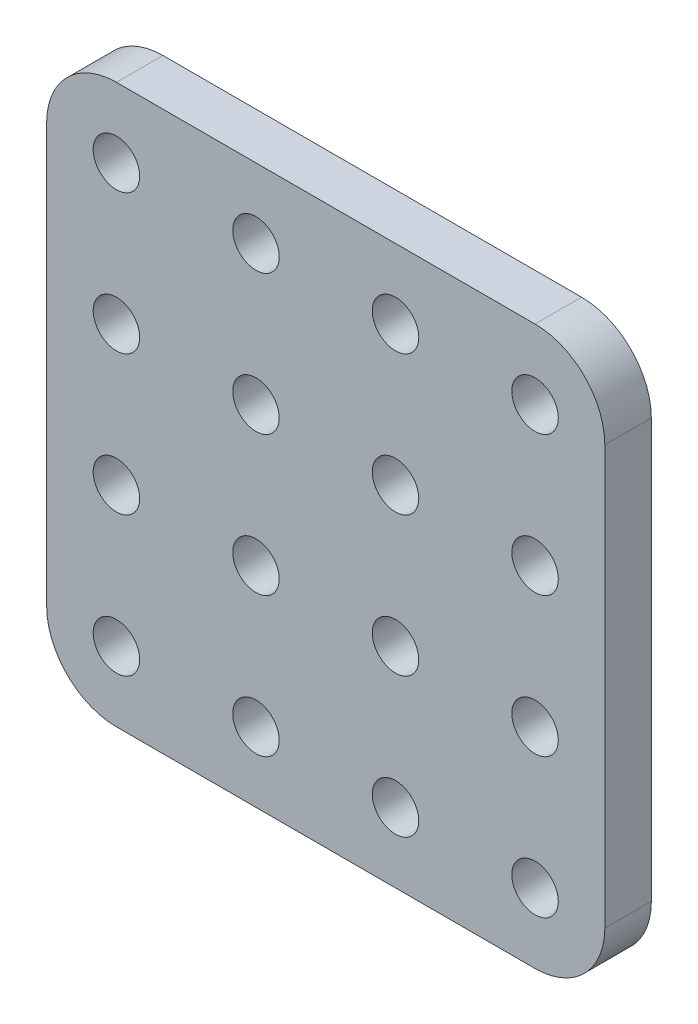
ISO-10303-21;
HEADER;
FILE_DESCRIPTION(('STEP AP214'),'2;1');
FILE_NAME('part.step','',(''),(''),'','','');
FILE_SCHEMA(('AUTOMOTIVE_DESIGN { 1 0 10303 214 1 1 1 1 }'));
ENDSEC;
DATA;
#1=APPLICATION_CONTEXT('core data for automotive mechanical design processes');
#2=APPLICATION_PROTOCOL_DEFINITION('international standard','automotive_design',2000,#1);
#3=PRODUCT_CONTEXT('',#1,'mechanical');
#4=PRODUCT('Part','Part','',(#3));
#5=PRODUCT_RELATED_PRODUCT_CATEGORY('part','',(#4));
#6=PRODUCT_DEFINITION_FORMATION('','',#4);
#7=PRODUCT_DEFINITION_CONTEXT('part definition',#1,'design');
#8=PRODUCT_DEFINITION('design','',#6,#7);
#9=PRODUCT_DEFINITION_SHAPE('','',#8);
#10=(LENGTH_UNIT() NAMED_UNIT(*) SI_UNIT(.MILLI.,.METRE.));
#11=(NAMED_UNIT(*) PLANE_ANGLE_UNIT() SI_UNIT($,.RADIAN.));
#12=(NAMED_UNIT(*) SI_UNIT($,.STERADIAN.) SOLID_ANGLE_UNIT());
#13=UNCERTAINTY_MEASURE_WITH_UNIT(LENGTH_MEASURE(1.E-05),#10,'distance_accuracy_value','');
#14=(GEOMETRIC_REPRESENTATION_CONTEXT(3) GLOBAL_UNCERTAINTY_ASSIGNED_CONTEXT((#13)) GLOBAL_UNIT_ASSIGNED_CONTEXT((#10,
#11,#12)) REPRESENTATION_CONTEXT('',''));
#15=CARTESIAN_POINT('',(0.,0.,0.));
#16=DIRECTION('',(0.,0.,1.));
#17=DIRECTION('',(1.,0.,0.));
#18=AXIS2_PLACEMENT_3D('',#15,#16,#17);
#19=CARTESIAN_POINT('',(-101.443383637,101.056539338,3.));
#20=DIRECTION('',(0.,0.,1.));
#21=DIRECTION('',(1.,0.,0.));
#22=AXIS2_PLACEMENT_3D('',#19,#20,#21);
#23=PLANE('',#22);
#24=CARTESIAN_POINT('',(-83.443383637,74.056539338,3.));
#25=DIRECTION('',(0.,0.,1.));
#26=DIRECTION('',(1.,0.,0.));
#27=AXIS2_PLACEMENT_3D('',#24,#25,#26);
#28=CIRCLE('',#27,1.5);
#29=CARTESIAN_POINT('',(-81.943383637,74.056539338,3.));
#30=VERTEX_POINT('',#29);
#31=EDGE_CURVE('E260',#30,#30,#28,.T.);
#32=ORIENTED_EDGE('',*,*,#31,.F.);
#33=EDGE_LOOP('',(#32));
#34=FACE_BOUND('',#33,.T.);
#35=CARTESIAN_POINT('',(-101.443383637,74.056539338,3.));
#36=DIRECTION('',(0.,0.,1.));
#37=DIRECTION('',(1.,0.,0.));
#38=AXIS2_PLACEMENT_3D('',#35,#36,#37);
#39=CIRCLE('',#38,1.5);
#40=CARTESIAN_POINT('',(-99.943383637,74.056539338,3.));
#41=VERTEX_POINT('',#40);
#42=EDGE_CURVE('E248',#41,#41,#39,.T.);
#43=ORIENTED_EDGE('',*,*,#42,.F.);
#44=EDGE_LOOP('',(#43));
#45=FACE_BOUND('',#44,.T.);
#46=CARTESIAN_POINT('',(-83.443383637,83.056539338,3.));
#47=DIRECTION('',(0.,0.,1.));
#48=DIRECTION('',(1.,0.,0.));
#49=AXIS2_PLACEMENT_3D('',#46,#47,#48);
#50=CIRCLE('',#49,1.5);
#51=CARTESIAN_POINT('',(-81.943383637,83.056539338,3.));
#52=VERTEX_POINT('',#51);
#53=EDGE_CURVE('E236',#52,#52,#50,.T.);
#54=ORIENTED_EDGE('',*,*,#53,.F.);
#55=EDGE_LOOP('',(#54));
#56=FACE_BOUND('',#55,.T.);
#57=CARTESIAN_POINT('',(-101.443383637,83.056539338,3.));
#58=DIRECTION('',(0.,0.,1.));
#59=DIRECTION('',(1.,0.,0.));
#60=AXIS2_PLACEMENT_3D('',#57,#58,#59);
#61=CIRCLE('',#60,1.5);
#62=CARTESIAN_POINT('',(-99.943383637,83.056539338,3.));
#63=VERTEX_POINT('',#62);
#64=EDGE_CURVE('E224',#63,#63,#61,.T.);
#65=ORIENTED_EDGE('',*,*,#64,.F.);
#66=EDGE_LOOP('',(#65));
#67=FACE_BOUND('',#66,.T.);
#68=CARTESIAN_POINT('',(-83.443383637,92.056539338,3.));
#69=DIRECTION('',(0.,0.,1.));
#70=DIRECTION('',(1.,0.,0.));
#71=AXIS2_PLACEMENT_3D('',#68,#69,#70);
#72=CIRCLE('',#71,1.5);
#73=CARTESIAN_POINT('',(-81.943383637,92.056539338,3.));
#74=VERTEX_POINT('',#73);
#75=EDGE_CURVE('E212',#74,#74,#72,.T.);
#76=ORIENTED_EDGE('',*,*,#75,.F.);
#77=EDGE_LOOP('',(#76));
#78=FACE_BOUND('',#77,.T.);
#79=CARTESIAN_POINT('',(-101.443383637,92.056539338,3.));
#80=DIRECTION('',(0.,0.,1.));
#81=DIRECTION('',(1.,0.,0.));
#82=AXIS2_PLACEMENT_3D('',#79,#80,#81);
#83=CIRCLE('',#82,1.5);
#84=CARTESIAN_POINT('',(-99.943383637,92.056539338,3.));
#85=VERTEX_POINT('',#84);
#86=EDGE_CURVE('E200',#85,#85,#83,.T.);
#87=ORIENTED_EDGE('',*,*,#86,.F.);
#88=EDGE_LOOP('',(#87));
#89=FACE_BOUND('',#88,.T.);
#90=CARTESIAN_POINT('',(-83.443383637,101.056539338,3.));
#91=DIRECTION('',(0.,0.,1.));
#92=DIRECTION('',(1.,0.,0.));
#93=AXIS2_PLACEMENT_3D('',#90,#91,#92);
#94=CIRCLE('',#93,1.5);
#95=CARTESIAN_POINT('',(-81.943383637,101.056539338,3.));
#96=VERTEX_POINT('',#95);
#97=EDGE_CURVE('E188',#96,#96,#94,.T.);
#98=ORIENTED_EDGE('',*,*,#97,.F.);
#99=EDGE_LOOP('',(#98));
#100=FACE_BOUND('',#99,.T.);
#101=CARTESIAN_POINT('',(-101.443383637,101.056539338,3.));
#102=DIRECTION('',(0.,0.,1.));
#103=DIRECTION('',(1.,0.,0.));
#104=AXIS2_PLACEMENT_3D('',#101,#102,#103);
#105=CIRCLE('',#104,1.5);
#106=CARTESIAN_POINT('',(-99.943383637,101.056539338,3.));
#107=VERTEX_POINT('',#106);
#108=EDGE_CURVE('E134',#107,#107,#105,.T.);
#109=ORIENTED_EDGE('',*,*,#108,.F.);
#110=EDGE_LOOP('',(#109));
#111=FACE_BOUND('',#110,.T.);
#112=CARTESIAN_POINT('',(-101.443383637,101.056539338,3.));
#113=DIRECTION('',(0.,0.,1.));
#114=DIRECTION('',(1.,0.,0.));
#115=AXIS2_PLACEMENT_3D('',#112,#113,#114);
#116=CIRCLE('',#115,4.5);
#117=CARTESIAN_POINT('',(-101.443383637,105.556539338,3.));
#118=VERTEX_POINT('',#117);
#119=CARTESIAN_POINT('',(-105.943383637,101.056539338,3.));
#120=VERTEX_POINT('',#119);
#121=EDGE_CURVE('E145',#118,#120,#116,.T.);
#122=ORIENTED_EDGE('',*,*,#121,.T.);
#123=DIRECTION('',(0.,-1.,0.));
#124=VECTOR('',#123,1.);
#125=CARTESIAN_POINT('',(-105.943383637,101.056539338,3.));
#126=LINE('',#125,#124);
#127=CARTESIAN_POINT('',(-105.943383637,74.056539338,3.));
#128=VERTEX_POINT('',#127);
#129=EDGE_CURVE('E93',#120,#128,#126,.T.);
#130=ORIENTED_EDGE('',*,*,#129,.T.);
#131=CARTESIAN_POINT('',(-101.443383637,74.056539338,3.));
#132=DIRECTION('',(0.,0.,1.));
#133=DIRECTION('',(1.,0.,0.));
#134=AXIS2_PLACEMENT_3D('',#131,#132,#133);
#135=CIRCLE('',#134,4.5);
#136=CARTESIAN_POINT('',(-101.443383637,69.556539338,3.));
#137=VERTEX_POINT('',#136);
#138=EDGE_CURVE('E160',#128,#137,#135,.T.);
#139=ORIENTED_EDGE('',*,*,#138,.T.);
#140=DIRECTION('',(1.,0.,0.));
#141=VECTOR('',#140,1.);
#142=CARTESIAN_POINT('',(-101.443383637,69.556539338,3.));
#143=LINE('',#142,#141);
#144=CARTESIAN_POINT('',(-74.443383637,69.556539338,3.));
#145=VERTEX_POINT('',#144);
#146=EDGE_CURVE('E173',#137,#145,#143,.T.);
#147=ORIENTED_EDGE('',*,*,#146,.T.);
#148=CARTESIAN_POINT('',(-74.443383637,74.056539338,3.));
#149=DIRECTION('',(0.,0.,1.));
#150=DIRECTION('',(1.,0.,0.));
#151=AXIS2_PLACEMENT_3D('',#148,#149,#150);
#152=CIRCLE('',#151,4.5);
#153=CARTESIAN_POINT('',(-69.943383637,74.056539338,3.));
#154=VERTEX_POINT('',#153);
#155=EDGE_CURVE('E112',#145,#154,#152,.T.);
#156=ORIENTED_EDGE('',*,*,#155,.T.);
#157=DIRECTION('',(0.,1.,0.));
#158=VECTOR('',#157,1.);
#159=CARTESIAN_POINT('',(-69.943383637,74.056539338,3.));
#160=LINE('',#159,#158);
#161=CARTESIAN_POINT('',(-69.943383637,101.056539338,3.));
#162=VERTEX_POINT('',#161);
#163=EDGE_CURVE('E106',#154,#162,#160,.T.);
#164=ORIENTED_EDGE('',*,*,#163,.T.);
#165=CARTESIAN_POINT('',(-74.443383637,101.056539338,3.));
#166=DIRECTION('',(0.,0.,1.));
#167=DIRECTION('',(1.,0.,0.));
#168=AXIS2_PLACEMENT_3D('',#165,#166,#167);
#169=CIRCLE('',#168,4.5);
#170=CARTESIAN_POINT('',(-74.443383637,105.556539338,3.));
#171=VERTEX_POINT('',#170);
#172=EDGE_CURVE('E110',#162,#171,#169,.T.);
#173=ORIENTED_EDGE('',*,*,#172,.T.);
#174=DIRECTION('',(-1.,0.,0.));
#175=VECTOR('',#174,1.);
#176=CARTESIAN_POINT('',(-74.443383637,105.556539338,3.));
#177=LINE('',#176,#175);
#178=EDGE_CURVE('E50',#171,#118,#177,.T.);
#179=ORIENTED_EDGE('',*,*,#178,.T.);
#180=EDGE_LOOP('',(#122,#130,#139,#147,#156,#164,#173,#179));
#181=FACE_BOUND('',#180,.T.);
#182=CARTESIAN_POINT('',(-92.443383637,101.056539338,3.));
#183=DIRECTION('',(0.,0.,1.));
#184=DIRECTION('',(1.,0.,0.));
#185=AXIS2_PLACEMENT_3D('',#182,#183,#184);
#186=CIRCLE('',#185,1.5);
#187=CARTESIAN_POINT('',(-90.943383637,101.056539338,3.));
#188=VERTEX_POINT('',#187);
#189=EDGE_CURVE('E182',#188,#188,#186,.T.);
#190=ORIENTED_EDGE('',*,*,#189,.F.);
#191=EDGE_LOOP('',(#190));
#192=FACE_BOUND('',#191,.T.);
#193=CARTESIAN_POINT('',(-74.443383637,101.056539338,3.));
#194=DIRECTION('',(0.,0.,1.));
#195=DIRECTION('',(1.,0.,0.));
#196=AXIS2_PLACEMENT_3D('',#193,#194,#195);
#197=CIRCLE('',#196,1.5);
#198=CARTESIAN_POINT('',(-72.943383637,101.056539338,3.));
#199=VERTEX_POINT('',#198);
#200=EDGE_CURVE('E194',#199,#199,#197,.T.);
#201=ORIENTED_EDGE('',*,*,#200,.F.);
#202=EDGE_LOOP('',(#201));
#203=FACE_BOUND('',#202,.T.);
#204=CARTESIAN_POINT('',(-92.443383637,92.056539338,3.));
#205=DIRECTION('',(0.,0.,1.));
#206=DIRECTION('',(1.,0.,0.));
#207=AXIS2_PLACEMENT_3D('',#204,#205,#206);
#208=CIRCLE('',#207,1.5);
#209=CARTESIAN_POINT('',(-90.943383637,92.056539338,3.));
#210=VERTEX_POINT('',#209);
#211=EDGE_CURVE('E206',#210,#210,#208,.T.);
#212=ORIENTED_EDGE('',*,*,#211,.F.);
#213=EDGE_LOOP('',(#212));
#214=FACE_BOUND('',#213,.T.);
#215=CARTESIAN_POINT('',(-74.443383637,92.056539338,3.));
#216=DIRECTION('',(0.,0.,1.));
#217=DIRECTION('',(1.,0.,0.));
#218=AXIS2_PLACEMENT_3D('',#215,#216,#217);
#219=CIRCLE('',#218,1.5);
#220=CARTESIAN_POINT('',(-72.943383637,92.056539338,3.));
#221=VERTEX_POINT('',#220);
#222=EDGE_CURVE('E218',#221,#221,#219,.T.);
#223=ORIENTED_EDGE('',*,*,#222,.F.);
#224=EDGE_LOOP('',(#223));
#225=FACE_BOUND('',#224,.T.);
#226=CARTESIAN_POINT('',(-92.443383637,83.056539338,3.));
#227=DIRECTION('',(0.,0.,1.));
#228=DIRECTION('',(1.,0.,0.));
#229=AXIS2_PLACEMENT_3D('',#226,#227,#228);
#230=CIRCLE('',#229,1.5);
#231=CARTESIAN_POINT('',(-90.943383637,83.056539338,3.));
#232=VERTEX_POINT('',#231);
#233=EDGE_CURVE('E230',#232,#232,#230,.T.);
#234=ORIENTED_EDGE('',*,*,#233,.F.);
#235=EDGE_LOOP('',(#234));
#236=FACE_BOUND('',#235,.T.);
#237=CARTESIAN_POINT('',(-74.443383637,83.056539338,3.));
#238=DIRECTION('',(0.,0.,1.));
#239=DIRECTION('',(1.,0.,0.));
#240=AXIS2_PLACEMENT_3D('',#237,#238,#239);
#241=CIRCLE('',#240,1.5);
#242=CARTESIAN_POINT('',(-72.943383637,83.056539338,3.));
#243=VERTEX_POINT('',#242);
#244=EDGE_CURVE('E242',#243,#243,#241,.T.);
#245=ORIENTED_EDGE('',*,*,#244,.F.);
#246=EDGE_LOOP('',(#245));
#247=FACE_BOUND('',#246,.T.);
#248=CARTESIAN_POINT('',(-92.443383637,74.056539338,3.));
#249=DIRECTION('',(0.,0.,1.));
#250=DIRECTION('',(1.,0.,0.));
#251=AXIS2_PLACEMENT_3D('',#248,#249,#250);
#252=CIRCLE('',#251,1.5);
#253=CARTESIAN_POINT('',(-90.943383637,74.056539338,3.));
#254=VERTEX_POINT('',#253);
#255=EDGE_CURVE('E254',#254,#254,#252,.T.);
#256=ORIENTED_EDGE('',*,*,#255,.F.);
#257=EDGE_LOOP('',(#256));
#258=FACE_BOUND('',#257,.T.);
#259=CARTESIAN_POINT('',(-74.443383637,74.056539338,3.));
#260=DIRECTION('',(0.,0.,1.));
#261=DIRECTION('',(1.,0.,0.));
#262=AXIS2_PLACEMENT_3D('',#259,#260,#261);
#263=CIRCLE('',#262,1.5);
#264=CARTESIAN_POINT('',(-72.943383637,74.056539338,3.));
#265=VERTEX_POINT('',#264);
#266=EDGE_CURVE('E266',#265,#265,#263,.T.);
#267=ORIENTED_EDGE('',*,*,#266,.F.);
#268=EDGE_LOOP('',(#267));
#269=FACE_BOUND('',#268,.T.);
#270=ADVANCED_FACE('F33',(#34,#45,#56,#67,#78,#89,#100,#111,#181,#192,#203,#214,#225,#236,#247,
#258,#269),#23,.T.);
#271=CARTESIAN_POINT('',(-101.443383637,101.056539338,0.));
#272=DIRECTION('',(0.,0.,1.));
#273=DIRECTION('',(1.,0.,0.));
#274=AXIS2_PLACEMENT_3D('',#271,#272,#273);
#275=PLANE('',#274);
#276=CARTESIAN_POINT('',(-83.443383637,74.056539338,0.));
#277=DIRECTION('',(0.,0.,1.));
#278=DIRECTION('',(1.,0.,0.));
#279=AXIS2_PLACEMENT_3D('',#276,#277,#278);
#280=CIRCLE('',#279,1.5);
#281=CARTESIAN_POINT('',(-81.943383637,74.056539338,0.));
#282=VERTEX_POINT('',#281);
#283=EDGE_CURVE('E263',#282,#282,#280,.T.);
#284=ORIENTED_EDGE('',*,*,#283,.T.);
#285=EDGE_LOOP('',(#284));
#286=FACE_BOUND('',#285,.T.);
#287=CARTESIAN_POINT('',(-101.443383637,74.056539338,0.));
#288=DIRECTION('',(0.,0.,1.));
#289=DIRECTION('',(1.,0.,0.));
#290=AXIS2_PLACEMENT_3D('',#287,#288,#289);
#291=CIRCLE('',#290,1.5);
#292=CARTESIAN_POINT('',(-99.943383637,74.056539338,0.));
#293=VERTEX_POINT('',#292);
#294=EDGE_CURVE('E251',#293,#293,#291,.T.);
#295=ORIENTED_EDGE('',*,*,#294,.T.);
#296=EDGE_LOOP('',(#295));
#297=FACE_BOUND('',#296,.T.);
#298=CARTESIAN_POINT('',(-83.443383637,83.056539338,0.));
#299=DIRECTION('',(0.,0.,1.));
#300=DIRECTION('',(1.,0.,0.));
#301=AXIS2_PLACEMENT_3D('',#298,#299,#300);
#302=CIRCLE('',#301,1.5);
#303=CARTESIAN_POINT('',(-81.943383637,83.056539338,0.));
#304=VERTEX_POINT('',#303);
#305=EDGE_CURVE('E239',#304,#304,#302,.T.);
#306=ORIENTED_EDGE('',*,*,#305,.T.);
#307=EDGE_LOOP('',(#306));
#308=FACE_BOUND('',#307,.T.);
#309=CARTESIAN_POINT('',(-101.443383637,83.056539338,0.));
#310=DIRECTION('',(0.,0.,1.));
#311=DIRECTION('',(1.,0.,0.));
#312=AXIS2_PLACEMENT_3D('',#309,#310,#311);
#313=CIRCLE('',#312,1.5);
#314=CARTESIAN_POINT('',(-99.943383637,83.056539338,0.));
#315=VERTEX_POINT('',#314);
#316=EDGE_CURVE('E227',#315,#315,#313,.T.);
#317=ORIENTED_EDGE('',*,*,#316,.T.);
#318=EDGE_LOOP('',(#317));
#319=FACE_BOUND('',#318,.T.);
#320=CARTESIAN_POINT('',(-83.443383637,92.056539338,0.));
#321=DIRECTION('',(0.,0.,1.));
#322=DIRECTION('',(1.,0.,0.));
#323=AXIS2_PLACEMENT_3D('',#320,#321,#322);
#324=CIRCLE('',#323,1.5);
#325=CARTESIAN_POINT('',(-81.943383637,92.056539338,0.));
#326=VERTEX_POINT('',#325);
#327=EDGE_CURVE('E215',#326,#326,#324,.T.);
#328=ORIENTED_EDGE('',*,*,#327,.T.);
#329=EDGE_LOOP('',(#328));
#330=FACE_BOUND('',#329,.T.);
#331=CARTESIAN_POINT('',(-101.443383637,92.056539338,0.));
#332=DIRECTION('',(0.,0.,1.));
#333=DIRECTION('',(1.,0.,0.));
#334=AXIS2_PLACEMENT_3D('',#331,#332,#333);
#335=CIRCLE('',#334,1.5);
#336=CARTESIAN_POINT('',(-99.943383637,92.056539338,0.));
#337=VERTEX_POINT('',#336);
#338=EDGE_CURVE('E203',#337,#337,#335,.T.);
#339=ORIENTED_EDGE('',*,*,#338,.T.);
#340=EDGE_LOOP('',(#339));
#341=FACE_BOUND('',#340,.T.);
#342=CARTESIAN_POINT('',(-83.443383637,101.056539338,0.));
#343=DIRECTION('',(0.,0.,1.));
#344=DIRECTION('',(1.,0.,0.));
#345=AXIS2_PLACEMENT_3D('',#342,#343,#344);
#346=CIRCLE('',#345,1.5);
#347=CARTESIAN_POINT('',(-81.943383637,101.056539338,0.));
#348=VERTEX_POINT('',#347);
#349=EDGE_CURVE('E191',#348,#348,#346,.T.);
#350=ORIENTED_EDGE('',*,*,#349,.T.);
#351=EDGE_LOOP('',(#350));
#352=FACE_BOUND('',#351,.T.);
#353=CARTESIAN_POINT('',(-101.443383637,101.056539338,0.));
#354=DIRECTION('',(0.,0.,1.));
#355=DIRECTION('',(1.,0.,0.));
#356=AXIS2_PLACEMENT_3D('',#353,#354,#355);
#357=CIRCLE('',#356,1.5);
#358=CARTESIAN_POINT('',(-99.943383637,101.056539338,0.));
#359=VERTEX_POINT('',#358);
#360=EDGE_CURVE('E179',#359,#359,#357,.T.);
#361=ORIENTED_EDGE('',*,*,#360,.T.);
#362=EDGE_LOOP('',(#361));
#363=FACE_BOUND('',#362,.T.);
#364=CARTESIAN_POINT('',(-101.443383637,101.056539338,0.));
#365=DIRECTION('',(0.,0.,1.));
#366=DIRECTION('',(1.,0.,0.));
#367=AXIS2_PLACEMENT_3D('',#364,#365,#366);
#368=CIRCLE('',#367,4.5);
#369=CARTESIAN_POINT('',(-101.443383637,105.556539338,0.));
#370=VERTEX_POINT('',#369);
#371=CARTESIAN_POINT('',(-105.943383637,101.056539338,0.));
#372=VERTEX_POINT('',#371);
#373=EDGE_CURVE('E130',#370,#372,#368,.T.);
#374=ORIENTED_EDGE('',*,*,#373,.F.);
#375=DIRECTION('',(-1.,0.,0.));
#376=VECTOR('',#375,1.);
#377=CARTESIAN_POINT('',(-74.443383637,105.556539338,0.));
#378=LINE('',#377,#376);
#379=CARTESIAN_POINT('',(-74.443383637,105.556539338,0.));
#380=VERTEX_POINT('',#379);
#381=EDGE_CURVE('E85',#380,#370,#378,.T.);
#382=ORIENTED_EDGE('',*,*,#381,.F.);
#383=CARTESIAN_POINT('',(-74.443383637,101.056539338,0.));
#384=DIRECTION('',(0.,0.,1.));
#385=DIRECTION('',(1.,0.,0.));
#386=AXIS2_PLACEMENT_3D('',#383,#384,#385);
#387=CIRCLE('',#386,4.5);
#388=CARTESIAN_POINT('',(-69.943383637,101.056539338,0.));
#389=VERTEX_POINT('',#388);
#390=EDGE_CURVE('E79',#389,#380,#387,.T.);
#391=ORIENTED_EDGE('',*,*,#390,.F.);
#392=DIRECTION('',(0.,1.,0.));
#393=VECTOR('',#392,1.);
#394=CARTESIAN_POINT('',(-69.943383637,74.056539338,0.));
#395=LINE('',#394,#393);
#396=CARTESIAN_POINT('',(-69.943383637,74.056539338,0.));
#397=VERTEX_POINT('',#396);
#398=EDGE_CURVE('E120',#397,#389,#395,.T.);
#399=ORIENTED_EDGE('',*,*,#398,.F.);
#400=CARTESIAN_POINT('',(-74.443383637,74.056539338,0.));
#401=DIRECTION('',(0.,0.,1.));
#402=DIRECTION('',(1.,0.,0.));
#403=AXIS2_PLACEMENT_3D('',#400,#401,#402);
#404=CIRCLE('',#403,4.5);
#405=CARTESIAN_POINT('',(-74.443383637,69.556539338,0.));
#406=VERTEX_POINT('',#405);
#407=EDGE_CURVE('E140',#406,#397,#404,.T.);
#408=ORIENTED_EDGE('',*,*,#407,.F.);
#409=DIRECTION('',(1.,0.,0.));
#410=VECTOR('',#409,1.);
#411=CARTESIAN_POINT('',(-101.443383637,69.556539338,0.));
#412=LINE('',#411,#410);
#413=CARTESIAN_POINT('',(-101.443383637,69.556539338,0.));
#414=VERTEX_POINT('',#413);
#415=EDGE_CURVE('E138',#414,#406,#412,.T.);
#416=ORIENTED_EDGE('',*,*,#415,.F.);
#417=CARTESIAN_POINT('',(-101.443383637,74.056539338,0.));
#418=DIRECTION('',(0.,0.,1.));
#419=DIRECTION('',(1.,0.,0.));
#420=AXIS2_PLACEMENT_3D('',#417,#418,#419);
#421=CIRCLE('',#420,4.5);
#422=CARTESIAN_POINT('',(-105.943383637,74.056539338,0.));
#423=VERTEX_POINT('',#422);
#424=EDGE_CURVE('E136',#423,#414,#421,.T.);
#425=ORIENTED_EDGE('',*,*,#424,.F.);
#426=DIRECTION('',(0.,-1.,0.));
#427=VECTOR('',#426,1.);
#428=CARTESIAN_POINT('',(-105.943383637,101.056539338,0.));
#429=LINE('',#428,#427);
#430=EDGE_CURVE('E133',#372,#423,#429,.T.);
#431=ORIENTED_EDGE('',*,*,#430,.F.);
#432=EDGE_LOOP('',(#374,#382,#391,#399,#408,#416,#425,#431));
#433=FACE_BOUND('',#432,.T.);
#434=CARTESIAN_POINT('',(-92.443383637,101.056539338,0.));
#435=DIRECTION('',(0.,0.,1.));
#436=DIRECTION('',(1.,0.,0.));
#437=AXIS2_PLACEMENT_3D('',#434,#435,#436);
#438=CIRCLE('',#437,1.5);
#439=CARTESIAN_POINT('',(-90.943383637,101.056539338,0.));
#440=VERTEX_POINT('',#439);
#441=EDGE_CURVE('E185',#440,#440,#438,.T.);
#442=ORIENTED_EDGE('',*,*,#441,.T.);
#443=EDGE_LOOP('',(#442));
#444=FACE_BOUND('',#443,.T.);
#445=CARTESIAN_POINT('',(-74.443383637,101.056539338,0.));
#446=DIRECTION('',(0.,0.,1.));
#447=DIRECTION('',(1.,0.,0.));
#448=AXIS2_PLACEMENT_3D('',#445,#446,#447);
#449=CIRCLE('',#448,1.5);
#450=CARTESIAN_POINT('',(-72.943383637,101.056539338,0.));
#451=VERTEX_POINT('',#450);
#452=EDGE_CURVE('E197',#451,#451,#449,.T.);
#453=ORIENTED_EDGE('',*,*,#452,.T.);
#454=EDGE_LOOP('',(#453));
#455=FACE_BOUND('',#454,.T.);
#456=CARTESIAN_POINT('',(-92.443383637,92.056539338,0.));
#457=DIRECTION('',(0.,0.,1.));
#458=DIRECTION('',(1.,0.,0.));
#459=AXIS2_PLACEMENT_3D('',#456,#457,#458);
#460=CIRCLE('',#459,1.5);
#461=CARTESIAN_POINT('',(-90.943383637,92.056539338,0.));
#462=VERTEX_POINT('',#461);
#463=EDGE_CURVE('E209',#462,#462,#460,.T.);
#464=ORIENTED_EDGE('',*,*,#463,.T.);
#465=EDGE_LOOP('',(#464));
#466=FACE_BOUND('',#465,.T.);
#467=CARTESIAN_POINT('',(-74.443383637,92.056539338,0.));
#468=DIRECTION('',(0.,0.,1.));
#469=DIRECTION('',(1.,0.,0.));
#470=AXIS2_PLACEMENT_3D('',#467,#468,#469);
#471=CIRCLE('',#470,1.5);
#472=CARTESIAN_POINT('',(-72.943383637,92.056539338,0.));
#473=VERTEX_POINT('',#472);
#474=EDGE_CURVE('E221',#473,#473,#471,.T.);
#475=ORIENTED_EDGE('',*,*,#474,.T.);
#476=EDGE_LOOP('',(#475));
#477=FACE_BOUND('',#476,.T.);
#478=CARTESIAN_POINT('',(-92.443383637,83.056539338,0.));
#479=DIRECTION('',(0.,0.,1.));
#480=DIRECTION('',(1.,0.,0.));
#481=AXIS2_PLACEMENT_3D('',#478,#479,#480);
#482=CIRCLE('',#481,1.5);
#483=CARTESIAN_POINT('',(-90.943383637,83.056539338,0.));
#484=VERTEX_POINT('',#483);
#485=EDGE_CURVE('E233',#484,#484,#482,.T.);
#486=ORIENTED_EDGE('',*,*,#485,.T.);
#487=EDGE_LOOP('',(#486));
#488=FACE_BOUND('',#487,.T.);
#489=CARTESIAN_POINT('',(-74.443383637,83.056539338,0.));
#490=DIRECTION('',(0.,0.,1.));
#491=DIRECTION('',(1.,0.,0.));
#492=AXIS2_PLACEMENT_3D('',#489,#490,#491);
#493=CIRCLE('',#492,1.5);
#494=CARTESIAN_POINT('',(-72.943383637,83.056539338,0.));
#495=VERTEX_POINT('',#494);
#496=EDGE_CURVE('E245',#495,#495,#493,.T.);
#497=ORIENTED_EDGE('',*,*,#496,.T.);
#498=EDGE_LOOP('',(#497));
#499=FACE_BOUND('',#498,.T.);
#500=CARTESIAN_POINT('',(-92.443383637,74.056539338,0.));
#501=DIRECTION('',(0.,0.,1.));
#502=DIRECTION('',(1.,0.,0.));
#503=AXIS2_PLACEMENT_3D('',#500,#501,#502);
#504=CIRCLE('',#503,1.5);
#505=CARTESIAN_POINT('',(-90.943383637,74.056539338,0.));
#506=VERTEX_POINT('',#505);
#507=EDGE_CURVE('E257',#506,#506,#504,.T.);
#508=ORIENTED_EDGE('',*,*,#507,.T.);
#509=EDGE_LOOP('',(#508));
#510=FACE_BOUND('',#509,.T.);
#511=CARTESIAN_POINT('',(-74.443383637,74.056539338,0.));
#512=DIRECTION('',(0.,0.,1.));
#513=DIRECTION('',(1.,0.,0.));
#514=AXIS2_PLACEMENT_3D('',#511,#512,#513);
#515=CIRCLE('',#514,1.5);
#516=CARTESIAN_POINT('',(-72.943383637,74.056539338,0.));
#517=VERTEX_POINT('',#516);
#518=EDGE_CURVE('E269',#517,#517,#515,.T.);
#519=ORIENTED_EDGE('',*,*,#518,.T.);
#520=EDGE_LOOP('',(#519));
#521=FACE_BOUND('',#520,.T.);
#522=ADVANCED_FACE('F164',(#286,#297,#308,#319,#330,#341,#352,#363,#433,#444,#455,#466,#477,
#488,#499,#510,#521),#275,.F.);
#523=CARTESIAN_POINT('',(-101.443383637,101.056539338,3.));
#524=DIRECTION('',(0.,0.,-1.));
#525=DIRECTION('',(-1.,0.,0.));
#526=AXIS2_PLACEMENT_3D('',#523,#524,#525);
#527=CYLINDRICAL_SURFACE('',#526,4.5);
#528=ORIENTED_EDGE('',*,*,#373,.T.);
#529=DIRECTION('',(0.,0.,-1.));
#530=VECTOR('',#529,1.);
#531=CARTESIAN_POINT('',(-105.943383637,101.056539338,3.));
#532=LINE('',#531,#530);
#533=EDGE_CURVE('E11',#120,#372,#532,.T.);
#534=ORIENTED_EDGE('',*,*,#533,.F.);
#535=ORIENTED_EDGE('',*,*,#121,.F.);
#536=DIRECTION('',(0.,0.,-1.));
#537=VECTOR('',#536,1.);
#538=CARTESIAN_POINT('',(-101.443383637,105.556539338,3.));
#539=LINE('',#538,#537);
#540=EDGE_CURVE('E126',#118,#370,#539,.T.);
#541=ORIENTED_EDGE('',*,*,#540,.T.);
#542=EDGE_LOOP('',(#528,#534,#535,#541));
#543=FACE_BOUND('',#542,.T.);
#544=ADVANCED_FACE('F35',(#543),#527,.T.);
#545=CARTESIAN_POINT('',(-105.943383637,101.056539338,3.));
#546=DIRECTION('',(1.,0.,0.));
#547=DIRECTION('',(0.,0.,-1.));
#548=AXIS2_PLACEMENT_3D('',#545,#546,#547);
#549=PLANE('',#548);
#550=ORIENTED_EDGE('',*,*,#430,.T.);
#551=DIRECTION('',(0.,0.,-1.));
#552=VECTOR('',#551,1.);
#553=CARTESIAN_POINT('',(-105.943383637,74.056539338,3.));
#554=LINE('',#553,#552);
#555=EDGE_CURVE('E42',#128,#423,#554,.T.);
#556=ORIENTED_EDGE('',*,*,#555,.F.);
#557=ORIENTED_EDGE('',*,*,#129,.F.);
#558=ORIENTED_EDGE('',*,*,#533,.T.);
#559=EDGE_LOOP('',(#550,#556,#557,#558));
#560=FACE_BOUND('',#559,.T.);
#561=ADVANCED_FACE('F304',(#560),#549,.F.);
#562=CARTESIAN_POINT('',(-101.443383637,74.056539338,3.));
#563=DIRECTION('',(0.,0.,-1.));
#564=DIRECTION('',(-1.,0.,0.));
#565=AXIS2_PLACEMENT_3D('',#562,#563,#564);
#566=CYLINDRICAL_SURFACE('',#565,4.5);
#567=ORIENTED_EDGE('',*,*,#424,.T.);
#568=DIRECTION('',(0.,0.,-1.));
#569=VECTOR('',#568,1.);
#570=CARTESIAN_POINT('',(-101.443383637,69.556539338,3.));
#571=LINE('',#570,#569);
#572=EDGE_CURVE('E152',#137,#414,#571,.T.);
#573=ORIENTED_EDGE('',*,*,#572,.F.);
#574=ORIENTED_EDGE('',*,*,#138,.F.);
#575=ORIENTED_EDGE('',*,*,#555,.T.);
#576=EDGE_LOOP('',(#567,#573,#574,#575));
#577=FACE_BOUND('',#576,.T.);
#578=ADVANCED_FACE('F158',(#577),#566,.T.);
#579=CARTESIAN_POINT('',(-101.443383637,69.556539338,3.));
#580=DIRECTION('',(0.,1.,0.));
#581=DIRECTION('',(0.,0.,1.));
#582=AXIS2_PLACEMENT_3D('',#579,#580,#581);
#583=PLANE('',#582);
#584=ORIENTED_EDGE('',*,*,#415,.T.);
#585=DIRECTION('',(0.,0.,-1.));
#586=VECTOR('',#585,1.);
#587=CARTESIAN_POINT('',(-74.443383637,69.556539338,3.));
#588=LINE('',#587,#586);
#589=EDGE_CURVE('E149',#145,#406,#588,.T.);
#590=ORIENTED_EDGE('',*,*,#589,.F.);
#591=ORIENTED_EDGE('',*,*,#146,.F.);
#592=ORIENTED_EDGE('',*,*,#572,.T.);
#593=EDGE_LOOP('',(#584,#590,#591,#592));
#594=FACE_BOUND('',#593,.T.);
#595=ADVANCED_FACE('F169',(#594),#583,.F.);
#596=CARTESIAN_POINT('',(-74.443383637,74.056539338,3.));
#597=DIRECTION('',(0.,0.,-1.));
#598=DIRECTION('',(-1.,0.,0.));
#599=AXIS2_PLACEMENT_3D('',#596,#597,#598);
#600=CYLINDRICAL_SURFACE('',#599,4.5);
#601=ORIENTED_EDGE('',*,*,#407,.T.);
#602=DIRECTION('',(0.,0.,-1.));
#603=VECTOR('',#602,1.);
#604=CARTESIAN_POINT('',(-69.943383637,74.056539338,3.));
#605=LINE('',#604,#603);
#606=EDGE_CURVE('E121',#154,#397,#605,.T.);
#607=ORIENTED_EDGE('',*,*,#606,.F.);
#608=ORIENTED_EDGE('',*,*,#155,.F.);
#609=ORIENTED_EDGE('',*,*,#589,.T.);
#610=EDGE_LOOP('',(#601,#607,#608,#609));
#611=FACE_BOUND('',#610,.T.);
#612=ADVANCED_FACE('F172',(#611),#600,.T.);
#613=CARTESIAN_POINT('',(-69.943383637,74.056539338,3.));
#614=DIRECTION('',(-1.,0.,0.));
#615=DIRECTION('',(0.,0.,1.));
#616=AXIS2_PLACEMENT_3D('',#613,#614,#615);
#617=PLANE('',#616);
#618=ORIENTED_EDGE('',*,*,#398,.T.);
#619=DIRECTION('',(0.,0.,-1.));
#620=VECTOR('',#619,1.);
#621=CARTESIAN_POINT('',(-69.943383637,101.056539338,3.));
#622=LINE('',#621,#620);
#623=EDGE_CURVE('E117',#162,#389,#622,.T.);
#624=ORIENTED_EDGE('',*,*,#623,.F.);
#625=ORIENTED_EDGE('',*,*,#163,.F.);
#626=ORIENTED_EDGE('',*,*,#606,.T.);
#627=EDGE_LOOP('',(#618,#624,#625,#626));
#628=FACE_BOUND('',#627,.T.);
#629=ADVANCED_FACE('F118',(#628),#617,.F.);
#630=CARTESIAN_POINT('',(-74.443383637,101.056539338,3.));
#631=DIRECTION('',(0.,0.,-1.));
#632=DIRECTION('',(-1.,0.,0.));
#633=AXIS2_PLACEMENT_3D('',#630,#631,#632);
#634=CYLINDRICAL_SURFACE('',#633,4.5);
#635=ORIENTED_EDGE('',*,*,#390,.T.);
#636=DIRECTION('',(0.,0.,-1.));
#637=VECTOR('',#636,1.);
#638=CARTESIAN_POINT('',(-74.443383637,105.556539338,3.));
#639=LINE('',#638,#637);
#640=EDGE_CURVE('E122',#171,#380,#639,.T.);
#641=ORIENTED_EDGE('',*,*,#640,.F.);
#642=ORIENTED_EDGE('',*,*,#172,.F.);
#643=ORIENTED_EDGE('',*,*,#623,.T.);
#644=EDGE_LOOP('',(#635,#641,#642,#643));
#645=FACE_BOUND('',#644,.T.);
#646=ADVANCED_FACE('F124',(#645),#634,.T.);
#647=CARTESIAN_POINT('',(-74.443383637,105.556539338,3.));
#648=DIRECTION('',(0.,-1.,0.));
#649=DIRECTION('',(0.,0.,-1.));
#650=AXIS2_PLACEMENT_3D('',#647,#648,#649);
#651=PLANE('',#650);
#652=ORIENTED_EDGE('',*,*,#381,.T.);
#653=ORIENTED_EDGE('',*,*,#540,.F.);
#654=ORIENTED_EDGE('',*,*,#178,.F.);
#655=ORIENTED_EDGE('',*,*,#640,.T.);
#656=EDGE_LOOP('',(#652,#653,#654,#655));
#657=FACE_BOUND('',#656,.T.);
#658=ADVANCED_FACE('F292',(#657),#651,.F.);
#659=CARTESIAN_POINT('',(-101.443383637,101.056539338,3.));
#660=DIRECTION('',(0.,0.,-1.));
#661=DIRECTION('',(-1.,0.,0.));
#662=AXIS2_PLACEMENT_3D('',#659,#660,#661);
#663=CYLINDRICAL_SURFACE('',#662,1.5);
#664=ORIENTED_EDGE('',*,*,#108,.T.);
#665=EDGE_LOOP('',(#664));
#666=FACE_BOUND('',#665,.T.);
#667=ORIENTED_EDGE('',*,*,#360,.F.);
#668=EDGE_LOOP('',(#667));
#669=FACE_BOUND('',#668,.T.);
#670=ADVANCED_FACE('F289',(#666,#669),#663,.F.);
#671=CARTESIAN_POINT('',(-92.443383637,101.056539338,3.));
#672=DIRECTION('',(0.,0.,-1.));
#673=DIRECTION('',(-1.,0.,0.));
#674=AXIS2_PLACEMENT_3D('',#671,#672,#673);
#675=CYLINDRICAL_SURFACE('',#674,1.5);
#676=ORIENTED_EDGE('',*,*,#189,.T.);
#677=EDGE_LOOP('',(#676));
#678=FACE_BOUND('',#677,.T.);
#679=ORIENTED_EDGE('',*,*,#441,.F.);
#680=EDGE_LOOP('',(#679));
#681=FACE_BOUND('',#680,.T.);
#682=ADVANCED_FACE('F368',(#678,#681),#675,.F.);
#683=CARTESIAN_POINT('',(-83.443383637,101.056539338,3.));
#684=DIRECTION('',(0.,0.,-1.));
#685=DIRECTION('',(-1.,0.,0.));
#686=AXIS2_PLACEMENT_3D('',#683,#684,#685);
#687=CYLINDRICAL_SURFACE('',#686,1.5);
#688=ORIENTED_EDGE('',*,*,#97,.T.);
#689=EDGE_LOOP('',(#688));
#690=FACE_BOUND('',#689,.T.);
#691=ORIENTED_EDGE('',*,*,#349,.F.);
#692=EDGE_LOOP('',(#691));
#693=FACE_BOUND('',#692,.T.);
#694=ADVANCED_FACE('F376',(#690,#693),#687,.F.);
#695=CARTESIAN_POINT('',(-74.443383637,101.056539338,3.));
#696=DIRECTION('',(0.,0.,-1.));
#697=DIRECTION('',(-1.,0.,0.));
#698=AXIS2_PLACEMENT_3D('',#695,#696,#697);
#699=CYLINDRICAL_SURFACE('',#698,1.5);
#700=ORIENTED_EDGE('',*,*,#200,.T.);
#701=EDGE_LOOP('',(#700));
#702=FACE_BOUND('',#701,.T.);
#703=ORIENTED_EDGE('',*,*,#452,.F.);
#704=EDGE_LOOP('',(#703));
#705=FACE_BOUND('',#704,.T.);
#706=ADVANCED_FACE('F384',(#702,#705),#699,.F.);
#707=CARTESIAN_POINT('',(-101.443383637,92.056539338,3.));
#708=DIRECTION('',(0.,0.,-1.));
#709=DIRECTION('',(-1.,0.,0.));
#710=AXIS2_PLACEMENT_3D('',#707,#708,#709);
#711=CYLINDRICAL_SURFACE('',#710,1.5);
#712=ORIENTED_EDGE('',*,*,#86,.T.);
#713=EDGE_LOOP('',(#712));
#714=FACE_BOUND('',#713,.T.);
#715=ORIENTED_EDGE('',*,*,#338,.F.);
#716=EDGE_LOOP('',(#715));
#717=FACE_BOUND('',#716,.T.);
#718=ADVANCED_FACE('F393',(#714,#717),#711,.F.);
#719=CARTESIAN_POINT('',(-92.443383637,92.056539338,3.));
#720=DIRECTION('',(0.,0.,-1.));
#721=DIRECTION('',(-1.,0.,0.));
#722=AXIS2_PLACEMENT_3D('',#719,#720,#721);
#723=CYLINDRICAL_SURFACE('',#722,1.5);
#724=ORIENTED_EDGE('',*,*,#211,.T.);
#725=EDGE_LOOP('',(#724));
#726=FACE_BOUND('',#725,.T.);
#727=ORIENTED_EDGE('',*,*,#463,.F.);
#728=EDGE_LOOP('',(#727));
#729=FACE_BOUND('',#728,.T.);
#730=ADVANCED_FACE('F402',(#726,#729),#723,.F.);
#731=CARTESIAN_POINT('',(-83.443383637,92.056539338,3.));
#732=DIRECTION('',(0.,0.,-1.));
#733=DIRECTION('',(-1.,0.,0.));
#734=AXIS2_PLACEMENT_3D('',#731,#732,#733);
#735=CYLINDRICAL_SURFACE('',#734,1.5);
#736=ORIENTED_EDGE('',*,*,#75,.T.);
#737=EDGE_LOOP('',(#736));
#738=FACE_BOUND('',#737,.T.);
#739=ORIENTED_EDGE('',*,*,#327,.F.);
#740=EDGE_LOOP('',(#739));
#741=FACE_BOUND('',#740,.T.);
#742=ADVANCED_FACE('F411',(#738,#741),#735,.F.);
#743=CARTESIAN_POINT('',(-74.443383637,92.056539338,3.));
#744=DIRECTION('',(0.,0.,-1.));
#745=DIRECTION('',(-1.,0.,0.));
#746=AXIS2_PLACEMENT_3D('',#743,#744,#745);
#747=CYLINDRICAL_SURFACE('',#746,1.5);
#748=ORIENTED_EDGE('',*,*,#222,.T.);
#749=EDGE_LOOP('',(#748));
#750=FACE_BOUND('',#749,.T.);
#751=ORIENTED_EDGE('',*,*,#474,.F.);
#752=EDGE_LOOP('',(#751));
#753=FACE_BOUND('',#752,.T.);
#754=ADVANCED_FACE('F420',(#750,#753),#747,.F.);
#755=CARTESIAN_POINT('',(-101.443383637,83.056539338,3.));
#756=DIRECTION('',(0.,0.,-1.));
#757=DIRECTION('',(-1.,0.,0.));
#758=AXIS2_PLACEMENT_3D('',#755,#756,#757);
#759=CYLINDRICAL_SURFACE('',#758,1.5);
#760=ORIENTED_EDGE('',*,*,#64,.T.);
#761=EDGE_LOOP('',(#760));
#762=FACE_BOUND('',#761,.T.);
#763=ORIENTED_EDGE('',*,*,#316,.F.);
#764=EDGE_LOOP('',(#763));
#765=FACE_BOUND('',#764,.T.);
#766=ADVANCED_FACE('F429',(#762,#765),#759,.F.);
#767=CARTESIAN_POINT('',(-92.443383637,83.056539338,3.));
#768=DIRECTION('',(0.,0.,-1.));
#769=DIRECTION('',(-1.,0.,0.));
#770=AXIS2_PLACEMENT_3D('',#767,#768,#769);
#771=CYLINDRICAL_SURFACE('',#770,1.5);
#772=ORIENTED_EDGE('',*,*,#233,.T.);
#773=EDGE_LOOP('',(#772));
#774=FACE_BOUND('',#773,.T.);
#775=ORIENTED_EDGE('',*,*,#485,.F.);
#776=EDGE_LOOP('',(#775));
#777=FACE_BOUND('',#776,.T.);
#778=ADVANCED_FACE('F438',(#774,#777),#771,.F.);
#779=CARTESIAN_POINT('',(-83.443383637,83.056539338,3.));
#780=DIRECTION('',(0.,0.,-1.));
#781=DIRECTION('',(-1.,0.,0.));
#782=AXIS2_PLACEMENT_3D('',#779,#780,#781);
#783=CYLINDRICAL_SURFACE('',#782,1.5);
#784=ORIENTED_EDGE('',*,*,#53,.T.);
#785=EDGE_LOOP('',(#784));
#786=FACE_BOUND('',#785,.T.);
#787=ORIENTED_EDGE('',*,*,#305,.F.);
#788=EDGE_LOOP('',(#787));
#789=FACE_BOUND('',#788,.T.);
#790=ADVANCED_FACE('F447',(#786,#789),#783,.F.);
#791=CARTESIAN_POINT('',(-74.443383637,83.056539338,3.));
#792=DIRECTION('',(0.,0.,-1.));
#793=DIRECTION('',(-1.,0.,0.));
#794=AXIS2_PLACEMENT_3D('',#791,#792,#793);
#795=CYLINDRICAL_SURFACE('',#794,1.5);
#796=ORIENTED_EDGE('',*,*,#244,.T.);
#797=EDGE_LOOP('',(#796));
#798=FACE_BOUND('',#797,.T.);
#799=ORIENTED_EDGE('',*,*,#496,.F.);
#800=EDGE_LOOP('',(#799));
#801=FACE_BOUND('',#800,.T.);
#802=ADVANCED_FACE('F456',(#798,#801),#795,.F.);
#803=CARTESIAN_POINT('',(-101.443383637,74.056539338,3.));
#804=DIRECTION('',(0.,0.,-1.));
#805=DIRECTION('',(-1.,0.,0.));
#806=AXIS2_PLACEMENT_3D('',#803,#804,#805);
#807=CYLINDRICAL_SURFACE('',#806,1.5);
#808=ORIENTED_EDGE('',*,*,#42,.T.);
#809=EDGE_LOOP('',(#808));
#810=FACE_BOUND('',#809,.T.);
#811=ORIENTED_EDGE('',*,*,#294,.F.);
#812=EDGE_LOOP('',(#811));
#813=FACE_BOUND('',#812,.T.);
#814=ADVANCED_FACE('F465',(#810,#813),#807,.F.);
#815=CARTESIAN_POINT('',(-92.443383637,74.056539338,3.));
#816=DIRECTION('',(0.,0.,-1.));
#817=DIRECTION('',(-1.,0.,0.));
#818=AXIS2_PLACEMENT_3D('',#815,#816,#817);
#819=CYLINDRICAL_SURFACE('',#818,1.5);
#820=ORIENTED_EDGE('',*,*,#255,.T.);
#821=EDGE_LOOP('',(#820));
#822=FACE_BOUND('',#821,.T.);
#823=ORIENTED_EDGE('',*,*,#507,.F.);
#824=EDGE_LOOP('',(#823));
#825=FACE_BOUND('',#824,.T.);
#826=ADVANCED_FACE('F474',(#822,#825),#819,.F.);
#827=CARTESIAN_POINT('',(-83.443383637,74.056539338,3.));
#828=DIRECTION('',(0.,0.,-1.));
#829=DIRECTION('',(-1.,0.,0.));
#830=AXIS2_PLACEMENT_3D('',#827,#828,#829);
#831=CYLINDRICAL_SURFACE('',#830,1.5);
#832=ORIENTED_EDGE('',*,*,#31,.T.);
#833=EDGE_LOOP('',(#832));
#834=FACE_BOUND('',#833,.T.);
#835=ORIENTED_EDGE('',*,*,#283,.F.);
#836=EDGE_LOOP('',(#835));
#837=FACE_BOUND('',#836,.T.);
#838=ADVANCED_FACE('F483',(#834,#837),#831,.F.);
#839=CARTESIAN_POINT('',(-74.443383637,74.056539338,3.));
#840=DIRECTION('',(0.,0.,-1.));
#841=DIRECTION('',(-1.,0.,0.));
#842=AXIS2_PLACEMENT_3D('',#839,#840,#841);
#843=CYLINDRICAL_SURFACE('',#842,1.5);
#844=ORIENTED_EDGE('',*,*,#266,.T.);
#845=EDGE_LOOP('',(#844));
#846=FACE_BOUND('',#845,.T.);
#847=ORIENTED_EDGE('',*,*,#518,.F.);
#848=EDGE_LOOP('',(#847));
#849=FACE_BOUND('',#848,.T.);
#850=ADVANCED_FACE('F275',(#846,#849),#843,.F.);
#851=CLOSED_SHELL('',(#270,#522,#544,#561,#578,#595,#612,#629,#646,#658,#670,#682,#694,#706,
#718,#730,#742,#754,#766,#778,#790,#802,#814,#826,#838,#850));
#852=MANIFOLD_SOLID_BREP('B2',#851);
#853=ADVANCED_BREP_SHAPE_REPRESENTATION('',(#18,#852),#14);
#854=SHAPE_DEFINITION_REPRESENTATION(#9,#853);
ENDSEC;
END-ISO-10303-21;
